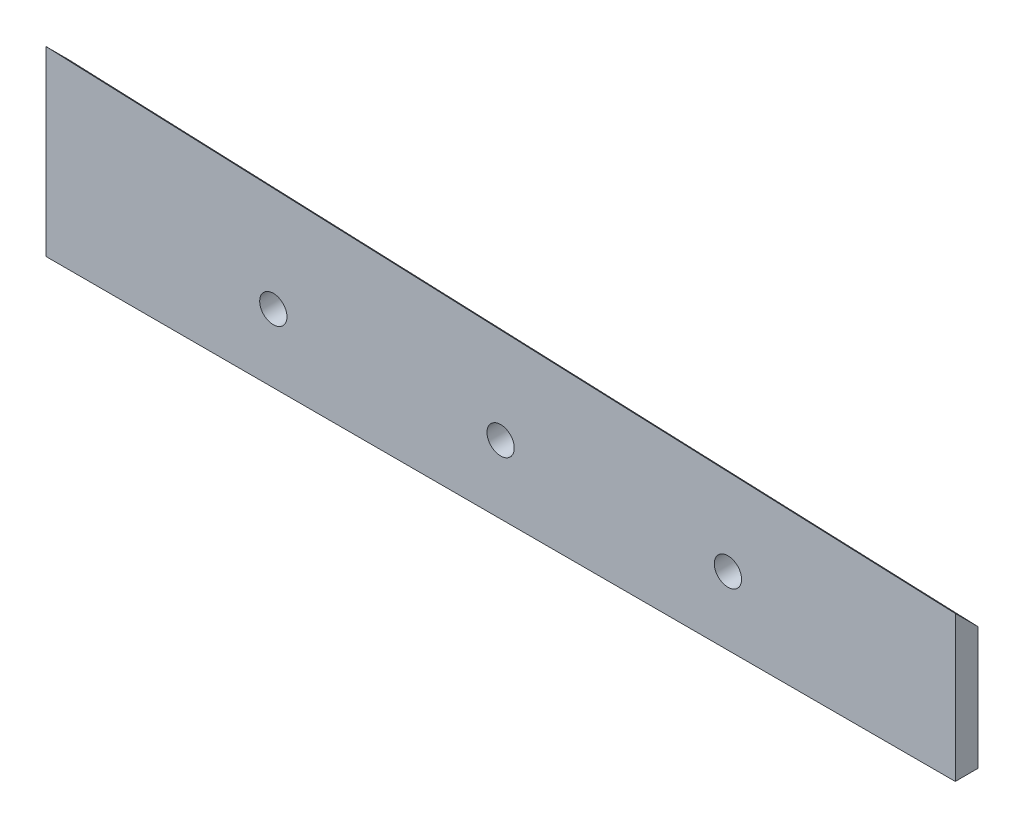
ISO-10303-21;
HEADER;
FILE_DESCRIPTION(('STEP AP214'),'2;1');
FILE_NAME('part.step','',(''),(''),'','','');
FILE_SCHEMA(('AUTOMOTIVE_DESIGN { 1 0 10303 214 1 1 1 1 }'));
ENDSEC;
DATA;
#1=APPLICATION_CONTEXT('core data for automotive mechanical design processes');
#2=APPLICATION_PROTOCOL_DEFINITION('international standard','automotive_design',2000,#1);
#3=PRODUCT_CONTEXT('',#1,'mechanical');
#4=PRODUCT('Part','Part','',(#3));
#5=PRODUCT_RELATED_PRODUCT_CATEGORY('part','',(#4));
#6=PRODUCT_DEFINITION_FORMATION('','',#4);
#7=PRODUCT_DEFINITION_CONTEXT('part definition',#1,'design');
#8=PRODUCT_DEFINITION('design','',#6,#7);
#9=PRODUCT_DEFINITION_SHAPE('','',#8);
#10=(LENGTH_UNIT() NAMED_UNIT(*) SI_UNIT(.MILLI.,.METRE.));
#11=(NAMED_UNIT(*) PLANE_ANGLE_UNIT() SI_UNIT($,.RADIAN.));
#12=(NAMED_UNIT(*) SI_UNIT($,.STERADIAN.) SOLID_ANGLE_UNIT());
#13=UNCERTAINTY_MEASURE_WITH_UNIT(LENGTH_MEASURE(1.E-05),#10,'distance_accuracy_value','');
#14=(GEOMETRIC_REPRESENTATION_CONTEXT(3) GLOBAL_UNCERTAINTY_ASSIGNED_CONTEXT((#13)) GLOBAL_UNIT_ASSIGNED_CONTEXT((#10,
#11,#12)) REPRESENTATION_CONTEXT('',''));
#15=CARTESIAN_POINT('',(0.,0.,0.));
#16=DIRECTION('',(0.,0.,1.));
#17=DIRECTION('',(1.,0.,0.));
#18=AXIS2_PLACEMENT_3D('',#15,#16,#17);
#19=CARTESIAN_POINT('',(200.,-149.232517464405,-415.826871086633));
#20=DIRECTION('',(0.,0.,-1.));
#21=DIRECTION('',(-1.,0.,0.));
#22=AXIS2_PLACEMENT_3D('',#19,#20,#21);
#23=PLANE('',#22);
#24=CARTESIAN_POINT('',(100.,-174.232517464405,-415.826871086633));
#25=DIRECTION('',(0.,0.,-1.));
#26=DIRECTION('',(-1.,0.,0.));
#27=AXIS2_PLACEMENT_3D('',#24,#25,#26);
#28=CIRCLE('',#27,3.);
#29=CARTESIAN_POINT('',(97.,-174.232517464405,-415.826871086632));
#30=VERTEX_POINT('',#29);
#31=EDGE_CURVE('E132',#30,#30,#28,.F.);
#32=ORIENTED_EDGE('',*,*,#31,.F.);
#33=EDGE_LOOP('',(#32));
#34=FACE_BOUND('',#33,.T.);
#35=CARTESIAN_POINT('',(150.,-174.232517464405,-415.826871086633));
#36=DIRECTION('',(0.,0.,-1.));
#37=DIRECTION('',(-1.,0.,0.));
#38=AXIS2_PLACEMENT_3D('',#35,#36,#37);
#39=CIRCLE('',#38,3.);
#40=CARTESIAN_POINT('',(147.,-174.232517464405,-415.826871086632));
#41=VERTEX_POINT('',#40);
#42=EDGE_CURVE('E136',#41,#41,#39,.F.);
#43=ORIENTED_EDGE('',*,*,#42,.F.);
#44=EDGE_LOOP('',(#43));
#45=FACE_BOUND('',#44,.T.);
#46=CARTESIAN_POINT('',(50.,-174.232517464405,-415.826871086633));
#47=DIRECTION('',(0.,0.,-1.));
#48=DIRECTION('',(-1.,0.,0.));
#49=AXIS2_PLACEMENT_3D('',#46,#47,#48);
#50=CIRCLE('',#49,3.);
#51=CARTESIAN_POINT('',(47.,-174.232517464405,-415.826871086632));
#52=VERTEX_POINT('',#51);
#53=EDGE_CURVE('E91',#52,#52,#50,.F.);
#54=ORIENTED_EDGE('',*,*,#53,.F.);
#55=EDGE_LOOP('',(#54));
#56=FACE_BOUND('',#55,.T.);
#57=DIRECTION('',(0.,-1.,0.));
#58=VECTOR('',#57,1.);
#59=CARTESIAN_POINT('',(200.,-149.232517464405,-415.826871086633));
#60=LINE('',#59,#58);
#61=CARTESIAN_POINT('',(200.,-157.232517464405,-415.826871086633));
#62=VERTEX_POINT('',#61);
#63=CARTESIAN_POINT('',(200.,-189.232517464405,-415.826871086633));
#64=VERTEX_POINT('',#63);
#65=EDGE_CURVE('E75',#62,#64,#60,.T.);
#66=ORIENTED_EDGE('',*,*,#65,.F.);
#67=DIRECTION('',(0.999200958721789,-0.0399680383488716,0.));
#68=VECTOR('',#67,1.);
#69=CARTESIAN_POINT('',(200.,-157.232517464405,-415.826871086633));
#70=LINE('',#69,#68);
#71=CARTESIAN_POINT('',(0.,-149.232517464405,-415.826871086633));
#72=VERTEX_POINT('',#71);
#73=EDGE_CURVE('E84',#72,#62,#70,.T.);
#74=ORIENTED_EDGE('',*,*,#73,.F.);
#75=DIRECTION('',(0.,-1.,0.));
#76=VECTOR('',#75,1.);
#77=CARTESIAN_POINT('',(0.,-149.232517464405,-415.826871086633));
#78=LINE('',#77,#76);
#79=CARTESIAN_POINT('',(0.,-189.232517464405,-415.826871086633));
#80=VERTEX_POINT('',#79);
#81=EDGE_CURVE('E90',#72,#80,#78,.T.);
#82=ORIENTED_EDGE('',*,*,#81,.T.);
#83=DIRECTION('',(-1.,0.,0.));
#84=VECTOR('',#83,1.);
#85=CARTESIAN_POINT('',(200.,-189.232517464405,-415.826871086633));
#86=LINE('',#85,#84);
#87=EDGE_CURVE('E86',#64,#80,#86,.T.);
#88=ORIENTED_EDGE('',*,*,#87,.F.);
#89=EDGE_LOOP('',(#66,#74,#82,#88));
#90=FACE_BOUND('',#89,.T.);
#91=ADVANCED_FACE('F33',(#34,#45,#56,#90),#23,.F.);
#92=CARTESIAN_POINT('',(200.,-189.232517464405,-415.826871086633));
#93=DIRECTION('',(0.,1.,0.));
#94=DIRECTION('',(0.,0.,1.));
#95=AXIS2_PLACEMENT_3D('',#92,#93,#94);
#96=PLANE('',#95);
#97=DIRECTION('',(0.,0.,-1.));
#98=VECTOR('',#97,1.);
#99=CARTESIAN_POINT('',(0.,-189.232517464405,-415.826871086633));
#100=LINE('',#99,#98);
#101=CARTESIAN_POINT('',(0.,-189.232517464405,-420.826871086633));
#102=VERTEX_POINT('',#101);
#103=EDGE_CURVE('E93',#80,#102,#100,.T.);
#104=ORIENTED_EDGE('',*,*,#103,.T.);
#105=DIRECTION('',(-1.,0.,0.));
#106=VECTOR('',#105,1.);
#107=CARTESIAN_POINT('',(200.,-189.232517464405,-420.826871086633));
#108=LINE('',#107,#106);
#109=CARTESIAN_POINT('',(200.,-189.232517464405,-420.826871086633));
#110=VERTEX_POINT('',#109);
#111=EDGE_CURVE('E101',#110,#102,#108,.T.);
#112=ORIENTED_EDGE('',*,*,#111,.F.);
#113=DIRECTION('',(0.,0.,-1.));
#114=VECTOR('',#113,1.);
#115=CARTESIAN_POINT('',(200.,-189.232517464405,-415.826871086633));
#116=LINE('',#115,#114);
#117=EDGE_CURVE('E87',#64,#110,#116,.T.);
#118=ORIENTED_EDGE('',*,*,#117,.F.);
#119=ORIENTED_EDGE('',*,*,#87,.T.);
#120=EDGE_LOOP('',(#104,#112,#118,#119));
#121=FACE_BOUND('',#120,.T.);
#122=ADVANCED_FACE('F109',(#121),#96,.F.);
#123=CARTESIAN_POINT('',(200.,-149.232517464405,-420.826871086633));
#124=DIRECTION('',(0.,0.,1.));
#125=DIRECTION('',(1.,0.,0.));
#126=AXIS2_PLACEMENT_3D('',#123,#124,#125);
#127=PLANE('',#126);
#128=CARTESIAN_POINT('',(100.,-174.232517464405,-420.826871086633));
#129=DIRECTION('',(0.,0.,-1.));
#130=DIRECTION('',(-1.,0.,0.));
#131=AXIS2_PLACEMENT_3D('',#128,#129,#130);
#132=CIRCLE('',#131,3.);
#133=CARTESIAN_POINT('',(97.,-174.232517464405,-420.826871086632));
#134=VERTEX_POINT('',#133);
#135=EDGE_CURVE('E147',#134,#134,#132,.T.);
#136=ORIENTED_EDGE('',*,*,#135,.F.);
#137=EDGE_LOOP('',(#136));
#138=FACE_BOUND('',#137,.T.);
#139=CARTESIAN_POINT('',(150.,-174.232517464405,-420.826871086633));
#140=DIRECTION('',(0.,0.,-1.));
#141=DIRECTION('',(-1.,0.,0.));
#142=AXIS2_PLACEMENT_3D('',#139,#140,#141);
#143=CIRCLE('',#142,3.);
#144=CARTESIAN_POINT('',(147.,-174.232517464405,-420.826871086632));
#145=VERTEX_POINT('',#144);
#146=EDGE_CURVE('E151',#145,#145,#143,.T.);
#147=ORIENTED_EDGE('',*,*,#146,.F.);
#148=EDGE_LOOP('',(#147));
#149=FACE_BOUND('',#148,.T.);
#150=CARTESIAN_POINT('',(50.,-174.232517464405,-420.826871086633));
#151=DIRECTION('',(0.,0.,-1.));
#152=DIRECTION('',(-1.,0.,0.));
#153=AXIS2_PLACEMENT_3D('',#150,#151,#152);
#154=CIRCLE('',#153,3.);
#155=CARTESIAN_POINT('',(47.,-174.232517464405,-420.826871086632));
#156=VERTEX_POINT('',#155);
#157=EDGE_CURVE('E96',#156,#156,#154,.T.);
#158=ORIENTED_EDGE('',*,*,#157,.F.);
#159=EDGE_LOOP('',(#158));
#160=FACE_BOUND('',#159,.T.);
#161=DIRECTION('',(0.,1.,0.));
#162=VECTOR('',#161,1.);
#163=CARTESIAN_POINT('',(0.,-149.232517464405,-420.826871086633));
#164=LINE('',#163,#162);
#165=CARTESIAN_POINT('',(0.,-154.236515865683,-420.826871086633));
#166=VERTEX_POINT('',#165);
#167=EDGE_CURVE('E88',#102,#166,#164,.T.);
#168=ORIENTED_EDGE('',*,*,#167,.T.);
#169=DIRECTION('',(0.999200958721789,-0.0399680383488716,0.));
#170=VECTOR('',#169,1.);
#171=CARTESIAN_POINT('',(199.480670990364,-162.215742705298,-420.826871086633));
#172=LINE('',#171,#170);
#173=CARTESIAN_POINT('',(200.,-162.236515865683,-420.826871086633));
#174=VERTEX_POINT('',#173);
#175=EDGE_CURVE('E41',#166,#174,#172,.T.);
#176=ORIENTED_EDGE('',*,*,#175,.T.);
#177=DIRECTION('',(0.,1.,0.));
#178=VECTOR('',#177,1.);
#179=CARTESIAN_POINT('',(200.,-149.232517464405,-420.826871086633));
#180=LINE('',#179,#178);
#181=EDGE_CURVE('E77',#110,#174,#180,.T.);
#182=ORIENTED_EDGE('',*,*,#181,.F.);
#183=ORIENTED_EDGE('',*,*,#111,.T.);
#184=EDGE_LOOP('',(#168,#176,#182,#183));
#185=FACE_BOUND('',#184,.T.);
#186=ADVANCED_FACE('F112',(#138,#149,#160,#185),#127,.F.);
#187=CARTESIAN_POINT('',(200.,0.,0.));
#188=DIRECTION('',(1.,0.,0.));
#189=DIRECTION('',(0.,0.,-1.));
#190=AXIS2_PLACEMENT_3D('',#187,#188,#189);
#191=PLANE('',#190);
#192=ORIENTED_EDGE('',*,*,#181,.T.);
#193=DIRECTION('',(0.,-0.707389341350145,-0.706824108066645));
#194=VECTOR('',#193,1.);
#195=CARTESIAN_POINT('',(200.,129.359953117927,-129.463399718318));
#196=LINE('',#195,#194);
#197=EDGE_CURVE('E11',#174,#62,#196,.F.);
#198=ORIENTED_EDGE('',*,*,#197,.T.);
#199=ORIENTED_EDGE('',*,*,#65,.T.);
#200=ORIENTED_EDGE('',*,*,#117,.T.);
#201=EDGE_LOOP('',(#192,#198,#199,#200));
#202=FACE_BOUND('',#201,.T.);
#203=ADVANCED_FACE('F74',(#202),#191,.T.);
#204=CARTESIAN_POINT('',(0.,0.,0.));
#205=DIRECTION('',(1.,0.,0.));
#206=DIRECTION('',(0.,0.,-1.));
#207=AXIS2_PLACEMENT_3D('',#204,#205,#206);
#208=PLANE('',#207);
#209=ORIENTED_EDGE('',*,*,#81,.F.);
#210=DIRECTION('',(0.,0.707389341350145,0.706824108066645));
#211=VECTOR('',#210,1.);
#212=CARTESIAN_POINT('',(0.,-153.235714906451,-419.826869808678));
#213=LINE('',#212,#211);
#214=EDGE_CURVE('E55',#72,#166,#213,.F.);
#215=ORIENTED_EDGE('',*,*,#214,.T.);
#216=ORIENTED_EDGE('',*,*,#167,.F.);
#217=ORIENTED_EDGE('',*,*,#103,.F.);
#218=EDGE_LOOP('',(#209,#215,#216,#217));
#219=FACE_BOUND('',#218,.T.);
#220=ADVANCED_FACE('F111',(#219),#208,.F.);
#221=CARTESIAN_POINT('',(200.,-157.232517464405,-415.826871086633));
#222=DIRECTION('',(-0.0282616709472112,-0.70654177368028,0.707106781186545));
#223=DIRECTION('',(-0.999200958721789,0.0399680383488716,0.));
#224=AXIS2_PLACEMENT_3D('',#221,#222,#223);
#225=PLANE('',#224);
#226=ORIENTED_EDGE('',*,*,#197,.F.);
#227=ORIENTED_EDGE('',*,*,#175,.F.);
#228=ORIENTED_EDGE('',*,*,#214,.F.);
#229=ORIENTED_EDGE('',*,*,#73,.T.);
#230=EDGE_LOOP('',(#226,#227,#228,#229));
#231=FACE_BOUND('',#230,.T.);
#232=ADVANCED_FACE('F35',(#231),#225,.F.);
#233=CARTESIAN_POINT('',(50.,-174.232517464405,-407.341589712394));
#234=DIRECTION('',(0.,0.,-1.));
#235=DIRECTION('',(-1.,0.,0.));
#236=AXIS2_PLACEMENT_3D('',#233,#234,#235);
#237=CYLINDRICAL_SURFACE('',#236,3.);
#238=CARTESIAN_POINT('',(47.,-174.232517464405,-415.826871086632));
#239=CARTESIAN_POINT('',(47.,-174.232517464405,-415.878954419966));
#240=CARTESIAN_POINT('',(47.,-174.232517464405,-415.931037753299));
#241=CARTESIAN_POINT('',(47.,-174.232517464405,-416.035204419966));
#242=CARTESIAN_POINT('',(47.,-174.232517464405,-416.087287753299));
#243=CARTESIAN_POINT('',(47.,-174.232517464405,-416.191454419966));
#244=CARTESIAN_POINT('',(47.,-174.232517464405,-416.243537753299));
#245=CARTESIAN_POINT('',(47.,-174.232517464405,-416.347704419966));
#246=CARTESIAN_POINT('',(47.,-174.232517464405,-416.399787753299));
#247=CARTESIAN_POINT('',(47.,-174.232517464405,-416.503954419966));
#248=CARTESIAN_POINT('',(47.,-174.232517464405,-416.556037753299));
#249=CARTESIAN_POINT('',(47.,-174.232517464405,-416.660204419966));
#250=CARTESIAN_POINT('',(47.,-174.232517464405,-416.712287753299));
#251=CARTESIAN_POINT('',(47.,-174.232517464405,-416.816454419966));
#252=CARTESIAN_POINT('',(47.,-174.232517464405,-416.868537753299));
#253=CARTESIAN_POINT('',(47.,-174.232517464405,-416.972704419966));
#254=CARTESIAN_POINT('',(47.,-174.232517464405,-417.024787753299));
#255=CARTESIAN_POINT('',(47.,-174.232517464405,-417.128954419966));
#256=CARTESIAN_POINT('',(47.,-174.232517464405,-417.181037753299));
#257=CARTESIAN_POINT('',(47.,-174.232517464405,-417.285204419966));
#258=CARTESIAN_POINT('',(47.,-174.232517464405,-417.337287753299));
#259=CARTESIAN_POINT('',(47.,-174.232517464405,-417.441454419966));
#260=CARTESIAN_POINT('',(47.,-174.232517464405,-417.493537753299));
#261=CARTESIAN_POINT('',(47.,-174.232517464405,-417.597704419966));
#262=CARTESIAN_POINT('',(47.,-174.232517464405,-417.649787753299));
#263=CARTESIAN_POINT('',(47.,-174.232517464405,-417.753954419966));
#264=CARTESIAN_POINT('',(47.,-174.232517464405,-417.806037753299));
#265=CARTESIAN_POINT('',(47.,-174.232517464405,-417.910204419966));
#266=CARTESIAN_POINT('',(47.,-174.232517464405,-417.962287753299));
#267=CARTESIAN_POINT('',(47.,-174.232517464405,-418.066454419966));
#268=CARTESIAN_POINT('',(47.,-174.232517464405,-418.118537753299));
#269=CARTESIAN_POINT('',(47.,-174.232517464405,-418.222704419966));
#270=CARTESIAN_POINT('',(47.,-174.232517464405,-418.274787753299));
#271=CARTESIAN_POINT('',(47.,-174.232517464405,-418.378954419966));
#272=CARTESIAN_POINT('',(47.,-174.232517464405,-418.431037753299));
#273=CARTESIAN_POINT('',(47.,-174.232517464405,-418.535204419966));
#274=CARTESIAN_POINT('',(47.,-174.232517464405,-418.587287753299));
#275=CARTESIAN_POINT('',(47.,-174.232517464405,-418.691454419966));
#276=CARTESIAN_POINT('',(47.,-174.232517464405,-418.743537753299));
#277=CARTESIAN_POINT('',(47.,-174.232517464405,-418.847704419966));
#278=CARTESIAN_POINT('',(47.,-174.232517464405,-418.899787753299));
#279=CARTESIAN_POINT('',(47.,-174.232517464405,-419.003954419966));
#280=CARTESIAN_POINT('',(47.,-174.232517464405,-419.056037753299));
#281=CARTESIAN_POINT('',(47.,-174.232517464405,-419.160204419966));
#282=CARTESIAN_POINT('',(47.,-174.232517464405,-419.212287753299));
#283=CARTESIAN_POINT('',(47.,-174.232517464405,-419.316454419966));
#284=CARTESIAN_POINT('',(47.,-174.232517464405,-419.368537753299));
#285=CARTESIAN_POINT('',(47.,-174.232517464405,-419.472704419966));
#286=CARTESIAN_POINT('',(47.,-174.232517464405,-419.524787753299));
#287=CARTESIAN_POINT('',(47.,-174.232517464405,-419.628954419966));
#288=CARTESIAN_POINT('',(47.,-174.232517464405,-419.681037753299));
#289=CARTESIAN_POINT('',(47.,-174.232517464405,-419.785204419966));
#290=CARTESIAN_POINT('',(47.,-174.232517464405,-419.837287753299));
#291=CARTESIAN_POINT('',(47.,-174.232517464405,-419.941454419966));
#292=CARTESIAN_POINT('',(47.,-174.232517464405,-419.993537753299));
#293=CARTESIAN_POINT('',(47.,-174.232517464405,-420.097704419966));
#294=CARTESIAN_POINT('',(47.,-174.232517464405,-420.149787753299));
#295=CARTESIAN_POINT('',(47.,-174.232517464405,-420.253954419966));
#296=CARTESIAN_POINT('',(47.,-174.232517464405,-420.306037753299));
#297=CARTESIAN_POINT('',(47.,-174.232517464405,-420.410204419966));
#298=CARTESIAN_POINT('',(47.,-174.232517464405,-420.462287753299));
#299=CARTESIAN_POINT('',(47.,-174.232517464405,-420.566454419966));
#300=CARTESIAN_POINT('',(47.,-174.232517464405,-420.618537753299));
#301=CARTESIAN_POINT('',(47.,-174.232517464405,-420.722704419966));
#302=CARTESIAN_POINT('',(47.,-174.232517464405,-420.774787753299));
#303=CARTESIAN_POINT('',(47.,-174.232517464405,-420.826871086632));
#304=B_SPLINE_CURVE_WITH_KNOTS('',3,(#238,#239,#240,#241,#242,#243,#244,#245,#246,#247,#248,
#249,#250,#251,#252,#253,#254,#255,#256,#257,#258,#259,#260,#261,#262,#263,#264,#265,#266,#267,
#268,#269,#270,#271,#272,#273,#274,#275,#276,#277,#278,#279,#280,#281,#282,#283,#284,#285,#286,
#287,#288,#289,#290,#291,#292,#293,#294,#295,#296,#297,#298,#299,#300,#301,#302,#303),
.UNSPECIFIED.,.F.,.F.,(4,2,2,2,2,2,2,2,2,2,2,2,2,2,2,2,2,2,2,2,2,2,2,2,2,2,2,2,2,2,2,2,4),(0.,
0.156250000000024,0.312500000000049,0.468750000000018,0.625000000000042,0.781250000000011,
0.937500000000036,1.09375,1.25000000000003,1.40625000000005,1.56250000000002,1.71875000000005,
1.87500000000002,2.03125000000004,2.18750000000001,2.34375000000003,2.5,2.65625000000003,
2.81250000000005,2.96875000000002,3.12500000000004,3.28125000000001,3.43750000000004,
3.59375000000001,3.75000000000003,3.90625000000006,4.06250000000002,4.21875000000005,
4.37500000000002,4.53125000000004,4.68750000000001,4.84375000000004,5.),.UNSPECIFIED.);
#305=EDGE_CURVE('BSEAM139',#52,#156,#304,.T.);
#306=ORIENTED_EDGE('',*,*,#53,.T.);
#307=ORIENTED_EDGE('',*,*,#157,.T.);
#308=ORIENTED_EDGE('',*,*,#305,.T.);
#309=ORIENTED_EDGE('',*,*,#305,.F.);
#310=EDGE_LOOP('',(#306,#308,#307,#309));
#311=FACE_BOUND('',#310,.T.);
#312=ADVANCED_FACE('F139',(#311),#237,.F.);
#313=CARTESIAN_POINT('',(150.,-174.232517464405,-407.341589712394));
#314=DIRECTION('',(0.,0.,-1.));
#315=DIRECTION('',(-1.,0.,0.));
#316=AXIS2_PLACEMENT_3D('',#313,#314,#315);
#317=CYLINDRICAL_SURFACE('',#316,3.);
#318=CARTESIAN_POINT('',(147.,-174.232517464405,-415.826871086632));
#319=CARTESIAN_POINT('',(147.,-174.232517464405,-415.878954419966));
#320=CARTESIAN_POINT('',(147.,-174.232517464405,-415.931037753299));
#321=CARTESIAN_POINT('',(147.,-174.232517464405,-416.035204419966));
#322=CARTESIAN_POINT('',(147.,-174.232517464405,-416.087287753299));
#323=CARTESIAN_POINT('',(147.,-174.232517464405,-416.191454419966));
#324=CARTESIAN_POINT('',(147.,-174.232517464405,-416.243537753299));
#325=CARTESIAN_POINT('',(147.,-174.232517464405,-416.347704419966));
#326=CARTESIAN_POINT('',(147.,-174.232517464405,-416.399787753299));
#327=CARTESIAN_POINT('',(147.,-174.232517464405,-416.503954419966));
#328=CARTESIAN_POINT('',(147.,-174.232517464405,-416.556037753299));
#329=CARTESIAN_POINT('',(147.,-174.232517464405,-416.660204419966));
#330=CARTESIAN_POINT('',(147.,-174.232517464405,-416.712287753299));
#331=CARTESIAN_POINT('',(147.,-174.232517464405,-416.816454419966));
#332=CARTESIAN_POINT('',(147.,-174.232517464405,-416.868537753299));
#333=CARTESIAN_POINT('',(147.,-174.232517464405,-416.972704419966));
#334=CARTESIAN_POINT('',(147.,-174.232517464405,-417.024787753299));
#335=CARTESIAN_POINT('',(147.,-174.232517464405,-417.128954419966));
#336=CARTESIAN_POINT('',(147.,-174.232517464405,-417.181037753299));
#337=CARTESIAN_POINT('',(147.,-174.232517464405,-417.285204419966));
#338=CARTESIAN_POINT('',(147.,-174.232517464405,-417.337287753299));
#339=CARTESIAN_POINT('',(147.,-174.232517464405,-417.441454419966));
#340=CARTESIAN_POINT('',(147.,-174.232517464405,-417.493537753299));
#341=CARTESIAN_POINT('',(147.,-174.232517464405,-417.597704419966));
#342=CARTESIAN_POINT('',(147.,-174.232517464405,-417.649787753299));
#343=CARTESIAN_POINT('',(147.,-174.232517464405,-417.753954419966));
#344=CARTESIAN_POINT('',(147.,-174.232517464405,-417.806037753299));
#345=CARTESIAN_POINT('',(147.,-174.232517464405,-417.910204419966));
#346=CARTESIAN_POINT('',(147.,-174.232517464405,-417.962287753299));
#347=CARTESIAN_POINT('',(147.,-174.232517464405,-418.066454419966));
#348=CARTESIAN_POINT('',(147.,-174.232517464405,-418.118537753299));
#349=CARTESIAN_POINT('',(147.,-174.232517464405,-418.222704419966));
#350=CARTESIAN_POINT('',(147.,-174.232517464405,-418.274787753299));
#351=CARTESIAN_POINT('',(147.,-174.232517464405,-418.378954419966));
#352=CARTESIAN_POINT('',(147.,-174.232517464405,-418.431037753299));
#353=CARTESIAN_POINT('',(147.,-174.232517464405,-418.535204419966));
#354=CARTESIAN_POINT('',(147.,-174.232517464405,-418.587287753299));
#355=CARTESIAN_POINT('',(147.,-174.232517464405,-418.691454419966));
#356=CARTESIAN_POINT('',(147.,-174.232517464405,-418.743537753299));
#357=CARTESIAN_POINT('',(147.,-174.232517464405,-418.847704419966));
#358=CARTESIAN_POINT('',(147.,-174.232517464405,-418.899787753299));
#359=CARTESIAN_POINT('',(147.,-174.232517464405,-419.003954419966));
#360=CARTESIAN_POINT('',(147.,-174.232517464405,-419.056037753299));
#361=CARTESIAN_POINT('',(147.,-174.232517464405,-419.160204419966));
#362=CARTESIAN_POINT('',(147.,-174.232517464405,-419.212287753299));
#363=CARTESIAN_POINT('',(147.,-174.232517464405,-419.316454419966));
#364=CARTESIAN_POINT('',(147.,-174.232517464405,-419.368537753299));
#365=CARTESIAN_POINT('',(147.,-174.232517464405,-419.472704419966));
#366=CARTESIAN_POINT('',(147.,-174.232517464405,-419.524787753299));
#367=CARTESIAN_POINT('',(147.,-174.232517464405,-419.628954419966));
#368=CARTESIAN_POINT('',(147.,-174.232517464405,-419.681037753299));
#369=CARTESIAN_POINT('',(147.,-174.232517464405,-419.785204419966));
#370=CARTESIAN_POINT('',(147.,-174.232517464405,-419.837287753299));
#371=CARTESIAN_POINT('',(147.,-174.232517464405,-419.941454419966));
#372=CARTESIAN_POINT('',(147.,-174.232517464405,-419.993537753299));
#373=CARTESIAN_POINT('',(147.,-174.232517464405,-420.097704419966));
#374=CARTESIAN_POINT('',(147.,-174.232517464405,-420.149787753299));
#375=CARTESIAN_POINT('',(147.,-174.232517464405,-420.253954419966));
#376=CARTESIAN_POINT('',(147.,-174.232517464405,-420.306037753299));
#377=CARTESIAN_POINT('',(147.,-174.232517464405,-420.410204419966));
#378=CARTESIAN_POINT('',(147.,-174.232517464405,-420.462287753299));
#379=CARTESIAN_POINT('',(147.,-174.232517464405,-420.566454419966));
#380=CARTESIAN_POINT('',(147.,-174.232517464405,-420.618537753299));
#381=CARTESIAN_POINT('',(147.,-174.232517464405,-420.722704419966));
#382=CARTESIAN_POINT('',(147.,-174.232517464405,-420.774787753299));
#383=CARTESIAN_POINT('',(147.,-174.232517464405,-420.826871086632));
#384=B_SPLINE_CURVE_WITH_KNOTS('',3,(#318,#319,#320,#321,#322,#323,#324,#325,#326,#327,#328,
#329,#330,#331,#332,#333,#334,#335,#336,#337,#338,#339,#340,#341,#342,#343,#344,#345,#346,#347,
#348,#349,#350,#351,#352,#353,#354,#355,#356,#357,#358,#359,#360,#361,#362,#363,#364,#365,#366,
#367,#368,#369,#370,#371,#372,#373,#374,#375,#376,#377,#378,#379,#380,#381,#382,#383),
.UNSPECIFIED.,.F.,.F.,(4,2,2,2,2,2,2,2,2,2,2,2,2,2,2,2,2,2,2,2,2,2,2,2,2,2,2,2,2,2,2,2,4),(0.,
0.156250000000024,0.312500000000049,0.468750000000018,0.625000000000042,0.781250000000011,
0.937500000000036,1.09375,1.25000000000003,1.40625000000005,1.56250000000002,1.71875000000005,
1.87500000000002,2.03125000000004,2.18750000000001,2.34375000000003,2.5,2.65625000000003,
2.81250000000005,2.96875000000002,3.12500000000004,3.28125000000001,3.43750000000004,
3.59375000000001,3.75000000000003,3.90625000000006,4.06250000000002,4.21875000000005,
4.37500000000002,4.53125000000004,4.68750000000001,4.84375000000004,5.),.UNSPECIFIED.);
#385=EDGE_CURVE('BSEAM142',#41,#145,#384,.T.);
#386=ORIENTED_EDGE('',*,*,#42,.T.);
#387=ORIENTED_EDGE('',*,*,#146,.T.);
#388=ORIENTED_EDGE('',*,*,#385,.T.);
#389=ORIENTED_EDGE('',*,*,#385,.F.);
#390=EDGE_LOOP('',(#386,#388,#387,#389));
#391=FACE_BOUND('',#390,.T.);
#392=ADVANCED_FACE('F142',(#391),#317,.F.);
#393=CARTESIAN_POINT('',(100.,-174.232517464405,-407.341589712394));
#394=DIRECTION('',(0.,0.,-1.));
#395=DIRECTION('',(-1.,0.,0.));
#396=AXIS2_PLACEMENT_3D('',#393,#394,#395);
#397=CYLINDRICAL_SURFACE('',#396,3.);
#398=CARTESIAN_POINT('',(97.,-174.232517464405,-415.826871086632));
#399=CARTESIAN_POINT('',(97.,-174.232517464405,-415.878954419966));
#400=CARTESIAN_POINT('',(97.,-174.232517464405,-415.931037753299));
#401=CARTESIAN_POINT('',(97.,-174.232517464405,-416.035204419966));
#402=CARTESIAN_POINT('',(97.,-174.232517464405,-416.087287753299));
#403=CARTESIAN_POINT('',(97.,-174.232517464405,-416.191454419966));
#404=CARTESIAN_POINT('',(97.,-174.232517464405,-416.243537753299));
#405=CARTESIAN_POINT('',(97.,-174.232517464405,-416.347704419966));
#406=CARTESIAN_POINT('',(97.,-174.232517464405,-416.399787753299));
#407=CARTESIAN_POINT('',(97.,-174.232517464405,-416.503954419966));
#408=CARTESIAN_POINT('',(97.,-174.232517464405,-416.556037753299));
#409=CARTESIAN_POINT('',(97.,-174.232517464405,-416.660204419966));
#410=CARTESIAN_POINT('',(97.,-174.232517464405,-416.712287753299));
#411=CARTESIAN_POINT('',(97.,-174.232517464405,-416.816454419966));
#412=CARTESIAN_POINT('',(97.,-174.232517464405,-416.868537753299));
#413=CARTESIAN_POINT('',(97.,-174.232517464405,-416.972704419966));
#414=CARTESIAN_POINT('',(97.,-174.232517464405,-417.024787753299));
#415=CARTESIAN_POINT('',(97.,-174.232517464405,-417.128954419966));
#416=CARTESIAN_POINT('',(97.,-174.232517464405,-417.181037753299));
#417=CARTESIAN_POINT('',(97.,-174.232517464405,-417.285204419966));
#418=CARTESIAN_POINT('',(97.,-174.232517464405,-417.337287753299));
#419=CARTESIAN_POINT('',(97.,-174.232517464405,-417.441454419966));
#420=CARTESIAN_POINT('',(97.,-174.232517464405,-417.493537753299));
#421=CARTESIAN_POINT('',(97.,-174.232517464405,-417.597704419966));
#422=CARTESIAN_POINT('',(97.,-174.232517464405,-417.649787753299));
#423=CARTESIAN_POINT('',(97.,-174.232517464405,-417.753954419966));
#424=CARTESIAN_POINT('',(97.,-174.232517464405,-417.806037753299));
#425=CARTESIAN_POINT('',(97.,-174.232517464405,-417.910204419966));
#426=CARTESIAN_POINT('',(97.,-174.232517464405,-417.962287753299));
#427=CARTESIAN_POINT('',(97.,-174.232517464405,-418.066454419966));
#428=CARTESIAN_POINT('',(97.,-174.232517464405,-418.118537753299));
#429=CARTESIAN_POINT('',(97.,-174.232517464405,-418.222704419966));
#430=CARTESIAN_POINT('',(97.,-174.232517464405,-418.274787753299));
#431=CARTESIAN_POINT('',(97.,-174.232517464405,-418.378954419966));
#432=CARTESIAN_POINT('',(97.,-174.232517464405,-418.431037753299));
#433=CARTESIAN_POINT('',(97.,-174.232517464405,-418.535204419966));
#434=CARTESIAN_POINT('',(97.,-174.232517464405,-418.587287753299));
#435=CARTESIAN_POINT('',(97.,-174.232517464405,-418.691454419966));
#436=CARTESIAN_POINT('',(97.,-174.232517464405,-418.743537753299));
#437=CARTESIAN_POINT('',(97.,-174.232517464405,-418.847704419966));
#438=CARTESIAN_POINT('',(97.,-174.232517464405,-418.899787753299));
#439=CARTESIAN_POINT('',(97.,-174.232517464405,-419.003954419966));
#440=CARTESIAN_POINT('',(97.,-174.232517464405,-419.056037753299));
#441=CARTESIAN_POINT('',(97.,-174.232517464405,-419.160204419966));
#442=CARTESIAN_POINT('',(97.,-174.232517464405,-419.212287753299));
#443=CARTESIAN_POINT('',(97.,-174.232517464405,-419.316454419966));
#444=CARTESIAN_POINT('',(97.,-174.232517464405,-419.368537753299));
#445=CARTESIAN_POINT('',(97.,-174.232517464405,-419.472704419966));
#446=CARTESIAN_POINT('',(97.,-174.232517464405,-419.524787753299));
#447=CARTESIAN_POINT('',(97.,-174.232517464405,-419.628954419966));
#448=CARTESIAN_POINT('',(97.,-174.232517464405,-419.681037753299));
#449=CARTESIAN_POINT('',(97.,-174.232517464405,-419.785204419966));
#450=CARTESIAN_POINT('',(97.,-174.232517464405,-419.837287753299));
#451=CARTESIAN_POINT('',(97.,-174.232517464405,-419.941454419966));
#452=CARTESIAN_POINT('',(97.,-174.232517464405,-419.993537753299));
#453=CARTESIAN_POINT('',(97.,-174.232517464405,-420.097704419966));
#454=CARTESIAN_POINT('',(97.,-174.232517464405,-420.149787753299));
#455=CARTESIAN_POINT('',(97.,-174.232517464405,-420.253954419966));
#456=CARTESIAN_POINT('',(97.,-174.232517464405,-420.306037753299));
#457=CARTESIAN_POINT('',(97.,-174.232517464405,-420.410204419966));
#458=CARTESIAN_POINT('',(97.,-174.232517464405,-420.462287753299));
#459=CARTESIAN_POINT('',(97.,-174.232517464405,-420.566454419966));
#460=CARTESIAN_POINT('',(97.,-174.232517464405,-420.618537753299));
#461=CARTESIAN_POINT('',(97.,-174.232517464405,-420.722704419966));
#462=CARTESIAN_POINT('',(97.,-174.232517464405,-420.774787753299));
#463=CARTESIAN_POINT('',(97.,-174.232517464405,-420.826871086632));
#464=B_SPLINE_CURVE_WITH_KNOTS('',3,(#398,#399,#400,#401,#402,#403,#404,#405,#406,#407,#408,
#409,#410,#411,#412,#413,#414,#415,#416,#417,#418,#419,#420,#421,#422,#423,#424,#425,#426,#427,
#428,#429,#430,#431,#432,#433,#434,#435,#436,#437,#438,#439,#440,#441,#442,#443,#444,#445,#446,
#447,#448,#449,#450,#451,#452,#453,#454,#455,#456,#457,#458,#459,#460,#461,#462,#463),
.UNSPECIFIED.,.F.,.F.,(4,2,2,2,2,2,2,2,2,2,2,2,2,2,2,2,2,2,2,2,2,2,2,2,2,2,2,2,2,2,2,2,4),(0.,
0.156250000000024,0.312500000000049,0.468750000000018,0.625000000000042,0.781250000000011,
0.937500000000036,1.09375,1.25000000000003,1.40625000000005,1.56250000000002,1.71875000000005,
1.87500000000002,2.03125000000004,2.18750000000001,2.34375000000003,2.5,2.65625000000003,
2.81250000000005,2.96875000000002,3.12500000000004,3.28125000000001,3.43750000000004,
3.59375000000001,3.75000000000003,3.90625000000006,4.06250000000002,4.21875000000005,
4.37500000000002,4.53125000000004,4.68750000000001,4.84375000000004,5.),.UNSPECIFIED.);
#465=EDGE_CURVE('BSEAM156',#30,#134,#464,.T.);
#466=ORIENTED_EDGE('',*,*,#31,.T.);
#467=ORIENTED_EDGE('',*,*,#135,.T.);
#468=ORIENTED_EDGE('',*,*,#465,.T.);
#469=ORIENTED_EDGE('',*,*,#465,.F.);
#470=EDGE_LOOP('',(#466,#468,#467,#469));
#471=FACE_BOUND('',#470,.T.);
#472=ADVANCED_FACE('F156',(#471),#397,.F.);
#473=CLOSED_SHELL('',(#91,#122,#186,#203,#220,#232,#312,#392,#472));
#474=MANIFOLD_SOLID_BREP('B2',#473);
#475=ADVANCED_BREP_SHAPE_REPRESENTATION('',(#18,#474),#14);
#476=SHAPE_DEFINITION_REPRESENTATION(#9,#475);
ENDSEC;
END-ISO-10303-21;
